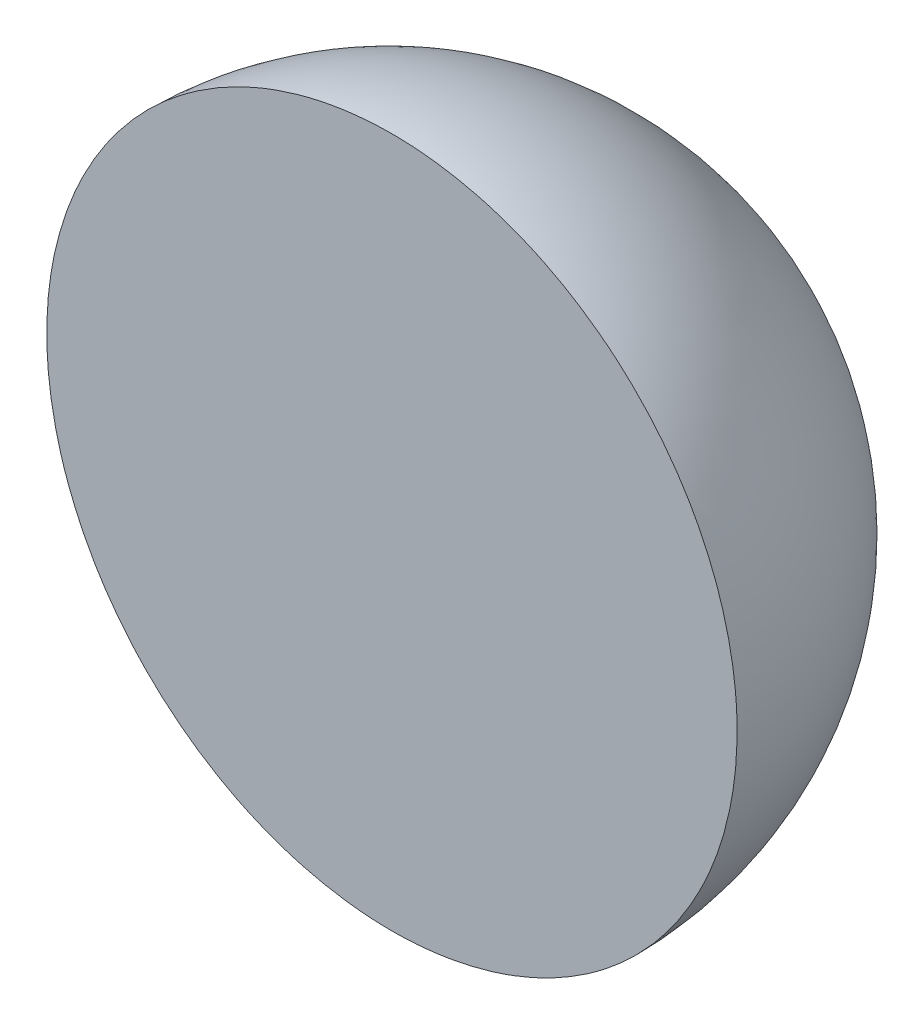
ISO-10303-21;
HEADER;
FILE_DESCRIPTION(('STEP AP214'),'2;1');
FILE_NAME('part.step','',(''),(''),'','','');
FILE_SCHEMA(('AUTOMOTIVE_DESIGN { 1 0 10303 214 1 1 1 1 }'));
ENDSEC;
DATA;
#1=APPLICATION_CONTEXT('core data for automotive mechanical design processes');
#2=APPLICATION_PROTOCOL_DEFINITION('international standard','automotive_design',2000,#1);
#3=PRODUCT_CONTEXT('',#1,'mechanical');
#4=PRODUCT('Part','Part','',(#3));
#5=PRODUCT_RELATED_PRODUCT_CATEGORY('part','',(#4));
#6=PRODUCT_DEFINITION_FORMATION('','',#4);
#7=PRODUCT_DEFINITION_CONTEXT('part definition',#1,'design');
#8=PRODUCT_DEFINITION('design','',#6,#7);
#9=PRODUCT_DEFINITION_SHAPE('','',#8);
#10=(LENGTH_UNIT() NAMED_UNIT(*) SI_UNIT(.MILLI.,.METRE.));
#11=(NAMED_UNIT(*) PLANE_ANGLE_UNIT() SI_UNIT($,.RADIAN.));
#12=(NAMED_UNIT(*) SI_UNIT($,.STERADIAN.) SOLID_ANGLE_UNIT());
#13=UNCERTAINTY_MEASURE_WITH_UNIT(LENGTH_MEASURE(1.E-05),#10,'distance_accuracy_value','');
#14=(GEOMETRIC_REPRESENTATION_CONTEXT(3) GLOBAL_UNCERTAINTY_ASSIGNED_CONTEXT((#13)) GLOBAL_UNIT_ASSIGNED_CONTEXT((#10,
#11,#12)) REPRESENTATION_CONTEXT('',''));
#15=CARTESIAN_POINT('',(0.,0.,0.));
#16=DIRECTION('',(0.,0.,1.));
#17=DIRECTION('',(1.,0.,0.));
#18=AXIS2_PLACEMENT_3D('',#15,#16,#17);
#19=CARTESIAN_POINT('',(-11.7,-21.2177781274036,0.));
#20=DIRECTION('',(0.,0.,-1.));
#21=DIRECTION('',(0.,1.,0.));
#22=AXIS2_PLACEMENT_3D('',#19,#20,#21);
#23=PLANE('',#22);
#24=CARTESIAN_POINT('',(-11.7,-21.2177781274036,0.));
#25=CARTESIAN_POINT('',(-11.7119070259785,-21.2177784493324,0.));
#26=CARTESIAN_POINT('',(-11.7238115308716,-21.2176728686486,0.));
#27=CARTESIAN_POINT('',(-11.7833556690516,-21.2166181608046,0.));
#28=CARTESIAN_POINT('',(-11.8309760200137,-21.214088126241,0.));
#29=CARTESIAN_POINT('',(-11.9745366768721,-21.2013376513807,0.));
#30=CARTESIAN_POINT('',(-12.0700605464309,-21.1858970833658,0.));
#31=CARTESIAN_POINT('',(-12.2580255031491,-21.1414901671753,0.));
#32=CARTESIAN_POINT('',(-12.350461816605,-21.1125038268554,0.));
#33=CARTESIAN_POINT('',(-12.5301779347019,-21.041616606117,0.));
#34=CARTESIAN_POINT('',(-12.6174614086084,-20.999725050796,0.));
#35=CARTESIAN_POINT('',(-12.7851228147506,-20.9038974622041,0.));
#36=CARTESIAN_POINT('',(-12.865500999772,-20.8499618700962,0.));
#37=CARTESIAN_POINT('',(-13.0310163245724,-20.7207470108468,0.));
#38=CARTESIAN_POINT('',(-13.1145405400804,-20.6433860782835,0.));
#39=CARTESIAN_POINT('',(-13.2674416939453,-20.4757123480112,0.));
#40=CARTESIAN_POINT('',(-13.3368116848211,-20.3853932267511,0.));
#41=CARTESIAN_POINT('',(-13.4593916002719,-20.1944043633131,0.));
#42=CARTESIAN_POINT('',(-13.5126046894965,-20.0937366532888,0.));
#43=CARTESIAN_POINT('',(-13.6013686787767,-19.8849071017698,0.));
#44=CARTESIAN_POINT('',(-13.6369212995645,-19.7767459915585,0.));
#45=CARTESIAN_POINT('',(-13.6893653304681,-19.5559852583267,0.));
#46=CARTESIAN_POINT('',(-13.7062559622272,-19.4433854503792,0.));
#47=CARTESIAN_POINT('',(-13.7208945151518,-19.2169476406652,0.));
#48=CARTESIAN_POINT('',(-13.7186421673775,-19.1031096215254,0.));
#49=CARTESIAN_POINT('',(-13.6950548531578,-18.8774258231938,0.));
#50=CARTESIAN_POINT('',(-13.6737201406449,-18.7655800175115,0.));
#51=CARTESIAN_POINT('',(-13.6125866207112,-18.5470681339371,0.));
#52=CARTESIAN_POINT('',(-13.5727875812873,-18.4404021211474,0.));
#53=CARTESIAN_POINT('',(-13.475804726406,-18.2352172780226,0.));
#54=CARTESIAN_POINT('',(-13.4186201908789,-18.1366987853554,0.));
#55=CARTESIAN_POINT('',(-13.3211480890914,-17.9972799761947,0.));
#56=CARTESIAN_POINT('',(-13.286701874842,-17.9521938027555,0.));
#57=CARTESIAN_POINT('',(-13.2141049929421,-17.8650342259559,0.));
#58=CARTESIAN_POINT('',(-13.1759507902207,-17.8229637653864,0.));
#59=CARTESIAN_POINT('',(-13.0564135096618,-17.7018638297539,0.));
#60=CARTESIAN_POINT('',(-12.9698693965755,-17.6278225352473,0.));
#61=CARTESIAN_POINT('',(-12.7855654269317,-17.4953434625433,0.));
#62=CARTESIAN_POINT('',(-12.6878058526036,-17.4369052918271,0.));
#63=CARTESIAN_POINT('',(-12.5348804291628,-17.3621633913221,0.));
#64=CARTESIAN_POINT('',(-12.4827913987382,-17.3393824580976,0.));
#65=CARTESIAN_POINT('',(-12.3769104573538,-17.2983064454393,0.));
#66=CARTESIAN_POINT('',(-12.3231200468272,-17.2800075313937,0.));
#67=CARTESIAN_POINT('',(-12.2142803608979,-17.2480375872992,0.));
#68=CARTESIAN_POINT('',(-12.1592333034037,-17.2343589890704,0.));
#69=CARTESIAN_POINT('',(-12.0481928796286,-17.2116838482045,0.));
#70=CARTESIAN_POINT('',(-11.9921996407056,-17.2026866805392,0.));
#71=CARTESIAN_POINT('',(-11.8805782474272,-17.1895463242489,0.));
#72=CARTESIAN_POINT('',(-11.8249594753707,-17.1853249985777,0.));
#73=CARTESIAN_POINT('',(-11.7553759713137,-17.1829337704804,0.));
#74=CARTESIAN_POINT('',(-11.7414646710556,-17.1825998528994,0.));
#75=CARTESIAN_POINT('',(-11.6718465745048,-17.1816497785385,0.));
#76=CARTESIAN_POINT('',(-11.6160893210854,-17.1831977083142,0.));
#77=CARTESIAN_POINT('',(-11.5039660143538,-17.1909674460664,0.));
#78=CARTESIAN_POINT('',(-11.447605583605,-17.1972677513813,0.));
#79=CARTESIAN_POINT('',(-11.3356051062193,-17.2145891678649,0.));
#80=CARTESIAN_POINT('',(-11.2799651568054,-17.2256109094523,0.));
#81=CARTESIAN_POINT('',(-11.1697169302244,-17.2523220137807,0.));
#82=CARTESIAN_POINT('',(-11.1151105052386,-17.2680190421536,0.));
#83=CARTESIAN_POINT('',(-11.007380718266,-17.3039676844598,0.));
#84=CARTESIAN_POINT('',(-10.9542586710034,-17.3242232005778,0.));
#85=CARTESIAN_POINT('',(-10.7979233230847,-17.3915418109911,0.));
#86=CARTESIAN_POINT('',(-10.6974725278283,-17.4452222720824,0.));
#87=CARTESIAN_POINT('',(-10.5070245964954,-17.5687060498926,0.));
#88=CARTESIAN_POINT('',(-10.4170277234899,-17.6385097722184,0.));
#89=CARTESIAN_POINT('',(-10.2918178534368,-17.7537349591058,0.));
#90=CARTESIAN_POINT('',(-10.251689092819,-17.7939263662524,0.));
#91=CARTESIAN_POINT('',(-10.1749939883805,-17.8775024348698,0.));
#92=CARTESIAN_POINT('',(-10.1384242547524,-17.9208839873295,0.));
#93=CARTESIAN_POINT('',(-10.03437522712,-18.0554656183656,0.));
#94=CARTESIAN_POINT('',(-9.97252972492967,-18.151126995887,0.));
#95=CARTESIAN_POINT('',(-9.86581393698764,-18.3514225004879,0.));
#96=CARTESIAN_POINT('',(-9.8209429650712,-18.4560562646649,0.));
#97=CARTESIAN_POINT('',(-9.74939589682433,-18.6713833818609,0.));
#98=CARTESIAN_POINT('',(-9.72271953457315,-18.7820766462925,0.));
#99=CARTESIAN_POINT('',(-9.68833144411755,-19.0063679668847,0.));
#100=CARTESIAN_POINT('',(-9.68061985895682,-19.1199660449486,0.));
#101=CARTESIAN_POINT('',(-9.6843769790102,-19.3468453919476,0.));
#102=CARTESIAN_POINT('',(-9.69584567522378,-19.4601266610314,0.));
#103=CARTESIAN_POINT('',(-9.73763845265593,-19.6831539871264,0.));
#104=CARTESIAN_POINT('',(-9.76796225193954,-19.7929000969721,0.));
#105=CARTESIAN_POINT('',(-9.84660510987922,-20.0057471164147,0.));
#106=CARTESIAN_POINT('',(-9.89492471510285,-20.1088478240663,0.));
#107=CARTESIAN_POINT('',(-10.008192575859,-20.3054822395122,0.));
#108=CARTESIAN_POINT('',(-10.073142292809,-20.3990151054942,0.));
#109=CARTESIAN_POINT('',(-10.2178088687767,-20.5738295471357,0.));
#110=CARTESIAN_POINT('',(-10.2975226804713,-20.6551136446851,0.));
#111=CARTESIAN_POINT('',(-10.4694291635367,-20.8031165128373,0.));
#112=CARTESIAN_POINT('',(-10.5616166099062,-20.8698413516625,0.));
#113=CARTESIAN_POINT('',(-10.7559780080171,-20.986934910201,0.));
#114=CARTESIAN_POINT('',(-10.8581622639935,-21.0372865171015,0.));
#115=CARTESIAN_POINT('',(-11.0809431085342,-21.1245815614211,0.));
#116=CARTESIAN_POINT('',(-11.2023372139977,-21.1594953718482,0.));
#117=CARTESIAN_POINT('',(-11.4492563382547,-21.2060565948875,0.));
#118=CARTESIAN_POINT('',(-11.5747676081458,-21.2177747415109,0.));
#119=CARTESIAN_POINT('',(-11.7,-21.2177781274036,0.));
#120=B_SPLINE_CURVE_WITH_KNOTS('',3,(#24,#25,#26,#27,#28,#29,#30,#31,#32,#33,#34,#35,#36,#37,
#38,#39,#40,#41,#42,#43,#44,#45,#46,#47,#48,#49,#50,#51,#52,#53,#54,#55,#56,#57,#58,#59,#60,#61,
#62,#63,#64,#65,#66,#67,#68,#69,#70,#71,#72,#73,#74,#75,#76,#77,#78,#79,#80,#81,#82,#83,#84,#85,
#86,#87,#88,#89,#90,#91,#92,#93,#94,#95,#96,#97,#98,#99,#100,#101,#102,#103,#104,#105,#106,#107,
#108,#109,#110,#111,#112,#113,#114,#115,#116,#117,#118,#119),.UNSPECIFIED.,.T.,.F.,(4,2,2,2,2,2,
2,2,2,2,2,2,2,2,2,2,2,2,2,2,2,2,2,2,2,2,2,2,2,2,2,2,2,2,2,2,2,2,2,2,2,2,2,2,2,2,2,4),(0.,
0.0357161507216739,0.178664868159858,0.46788408941511,0.75753152269868,1.04697015045647,
1.33639817805589,1.67627950083663,2.01632725226986,2.35630835557648,2.69625632662359,
3.03621847573267,3.37618540098299,3.71614780230132,4.0561144753424,4.39609523098987,
4.56613876205517,4.73634602758777,5.076314841371,5.41627510194707,5.58666413788717,
5.75690688348388,5.92686939981535,6.09680921824537,6.26392653395288,6.30567225767388,
6.47278957338138,6.64272939629602,6.81269191710907,6.98293465822539,7.15332368967971,
7.49328395026675,7.83325276403901,8.00346002428905,8.17350355007473,8.51348431625619,
8.85345133785925,9.19341339061557,9.53337800756103,9.87334246497508,10.2133018391203,
10.553271539334,10.8932711255957,11.2332006136677,11.5729881491321,11.9131296873686,
12.2899258428454,12.6655711963342),.UNSPECIFIED.);
#121=CARTESIAN_POINT('',(-11.7,-21.2177781274036,0.));
#122=VERTEX_POINT('',#121);
#123=EDGE_CURVE('E10',#122,#122,#120,.T.);
#124=ORIENTED_EDGE('',*,*,#123,.F.);
#125=EDGE_LOOP('',(#124));
#126=FACE_BOUND('',#125,.T.);
#127=ADVANCED_FACE('F15',(#126),#23,.F.);
#128=CARTESIAN_POINT('',(-11.7,-19.2,0.0178571428571104));
#129=DIRECTION('',(0.,1.,0.));
#130=DIRECTION('',(-1.,0.,0.));
#131=AXIS2_PLACEMENT_3D('',#128,#129,#130);
#132=SPHERICAL_SURFACE('',#131,2.0178571428571);
#133=ORIENTED_EDGE('',*,*,#123,.T.);
#134=EDGE_LOOP('',(#133));
#135=FACE_BOUND('',#134,.T.);
#136=ADVANCED_FACE('F26',(#135),#132,.T.);
#137=CLOSED_SHELL('',(#127,#136));
#138=MANIFOLD_SOLID_BREP('B1',#137);
#139=ADVANCED_BREP_SHAPE_REPRESENTATION('',(#18,#138),#14);
#140=SHAPE_DEFINITION_REPRESENTATION(#9,#139);
ENDSEC;
END-ISO-10303-21;
